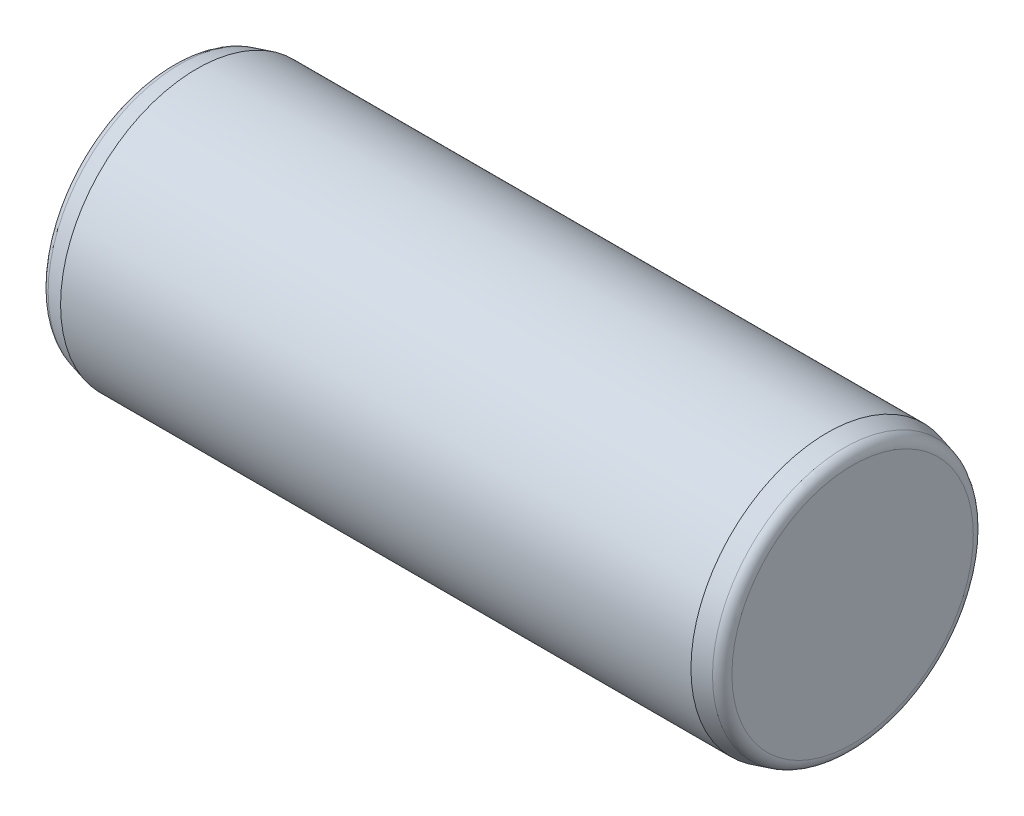
ISO-10303-21;
HEADER;
FILE_DESCRIPTION(('STEP AP214'),'2;1');
FILE_NAME('part.step','',(''),(''),'','','');
FILE_SCHEMA(('AUTOMOTIVE_DESIGN { 1 0 10303 214 1 1 1 1 }'));
ENDSEC;
DATA;
#1=APPLICATION_CONTEXT('core data for automotive mechanical design processes');
#2=APPLICATION_PROTOCOL_DEFINITION('international standard','automotive_design',2000,#1);
#3=PRODUCT_CONTEXT('',#1,'mechanical');
#4=PRODUCT('Part','Part','',(#3));
#5=PRODUCT_RELATED_PRODUCT_CATEGORY('part','',(#4));
#6=PRODUCT_DEFINITION_FORMATION('','',#4);
#7=PRODUCT_DEFINITION_CONTEXT('part definition',#1,'design');
#8=PRODUCT_DEFINITION('design','',#6,#7);
#9=PRODUCT_DEFINITION_SHAPE('','',#8);
#10=(LENGTH_UNIT() NAMED_UNIT(*) SI_UNIT(.MILLI.,.METRE.));
#11=(NAMED_UNIT(*) PLANE_ANGLE_UNIT() SI_UNIT($,.RADIAN.));
#12=(NAMED_UNIT(*) SI_UNIT($,.STERADIAN.) SOLID_ANGLE_UNIT());
#13=UNCERTAINTY_MEASURE_WITH_UNIT(LENGTH_MEASURE(1.E-05),#10,'distance_accuracy_value','');
#14=(GEOMETRIC_REPRESENTATION_CONTEXT(3) GLOBAL_UNCERTAINTY_ASSIGNED_CONTEXT((#13)) GLOBAL_UNIT_ASSIGNED_CONTEXT((#10,
#11,#12)) REPRESENTATION_CONTEXT('',''));
#15=CARTESIAN_POINT('',(0.,0.,0.));
#16=DIRECTION('',(0.,0.,1.));
#17=DIRECTION('',(1.,0.,0.));
#18=AXIS2_PLACEMENT_3D('',#15,#16,#17);
#19=CARTESIAN_POINT('',(0.,0.,0.));
#20=DIRECTION('',(1.,0.,0.));
#21=DIRECTION('',(0.,0.,-1.));
#22=AXIS2_PLACEMENT_3D('',#19,#20,#21);
#23=PLANE('',#22);
#24=CARTESIAN_POINT('',(0.,0.,0.));
#25=DIRECTION('',(1.,0.,0.));
#26=DIRECTION('',(0.,0.,-1.));
#27=AXIS2_PLACEMENT_3D('',#24,#25,#26);
#28=CIRCLE('',#27,5.31633650601052);
#29=CARTESIAN_POINT('',(0.,0.,-5.31633650601052));
#30=VERTEX_POINT('',#29);
#31=EDGE_CURVE('E56',#30,#30,#28,.F.);
#32=ORIENTED_EDGE('',*,*,#31,.T.);
#33=EDGE_LOOP('',(#32));
#34=FACE_BOUND('',#33,.T.);
#35=ADVANCED_FACE('F41',(#34),#23,.F.);
#36=CARTESIAN_POINT('',(1.11961524227056,0.,0.));
#37=DIRECTION('',(1.,0.,0.));
#38=DIRECTION('',(0.,0.,-1.));
#39=AXIS2_PLACEMENT_3D('',#36,#37,#38);
#40=CONICAL_SURFACE('',#39,6.,0.26179938779915);
#41=CARTESIAN_POINT('',(0.370590477448696,0.,0.));
#42=DIRECTION('',(-1.,0.,0.));
#43=DIRECTION('',(0.,0.,1.));
#44=AXIS2_PLACEMENT_3D('',#41,#42,#43);
#45=CIRCLE('',#44,5.79929941915506);
#46=CARTESIAN_POINT('',(0.370590477448696,0.,5.79929941915506));
#47=VERTEX_POINT('',#46);
#48=EDGE_CURVE('E52',#47,#47,#45,.F.);
#49=ORIENTED_EDGE('',*,*,#48,.T.);
#50=EDGE_LOOP('',(#49));
#51=FACE_BOUND('',#50,.T.);
#52=CARTESIAN_POINT('',(1.11961524227056,0.,0.));
#53=DIRECTION('',(-1.,0.,0.));
#54=DIRECTION('',(0.,0.,1.));
#55=AXIS2_PLACEMENT_3D('',#52,#53,#54);
#56=CIRCLE('',#55,6.);
#57=CARTESIAN_POINT('',(1.11961524227056,0.,6.));
#58=VERTEX_POINT('',#57);
#59=EDGE_CURVE('E61',#58,#58,#56,.T.);
#60=ORIENTED_EDGE('',*,*,#59,.T.);
#61=EDGE_LOOP('',(#60));
#62=FACE_BOUND('',#61,.T.);
#63=ADVANCED_FACE('F80',(#51,#62),#40,.T.);
#64=CARTESIAN_POINT('',(0.,0.,0.));
#65=DIRECTION('',(-1.,0.,0.));
#66=DIRECTION('',(0.,0.,1.));
#67=AXIS2_PLACEMENT_3D('',#64,#65,#66);
#68=CYLINDRICAL_SURFACE('',#67,6.);
#69=ORIENTED_EDGE('',*,*,#59,.F.);
#70=EDGE_LOOP('',(#69));
#71=FACE_BOUND('',#70,.T.);
#72=CARTESIAN_POINT('',(28.8803847577293,0.,0.));
#73=DIRECTION('',(-1.,0.,0.));
#74=DIRECTION('',(0.,0.,1.));
#75=AXIS2_PLACEMENT_3D('',#72,#73,#74);
#76=CIRCLE('',#75,6.);
#77=CARTESIAN_POINT('',(28.8803847577293,0.,6.));
#78=VERTEX_POINT('',#77);
#79=EDGE_CURVE('E64',#78,#78,#76,.T.);
#80=ORIENTED_EDGE('',*,*,#79,.T.);
#81=EDGE_LOOP('',(#80));
#82=FACE_BOUND('',#81,.T.);
#83=ADVANCED_FACE('F68',(#71,#82),#68,.T.);
#84=CARTESIAN_POINT('',(29.9999999999998,0.,0.));
#85=DIRECTION('',(-1.,0.,0.));
#86=DIRECTION('',(0.,0.,1.));
#87=AXIS2_PLACEMENT_3D('',#84,#85,#86);
#88=CONICAL_SURFACE('',#87,5.7,0.261799387799151);
#89=CARTESIAN_POINT('',(29.6294095225514,0.,0.));
#90=DIRECTION('',(1.,0.,0.));
#91=DIRECTION('',(0.,0.,-1.));
#92=AXIS2_PLACEMENT_3D('',#89,#90,#91);
#93=CIRCLE('',#92,5.79929941915505);
#94=CARTESIAN_POINT('',(29.6294095225514,0.,-5.79929941915506));
#95=VERTEX_POINT('',#94);
#96=EDGE_CURVE('E48',#95,#95,#93,.F.);
#97=ORIENTED_EDGE('',*,*,#96,.T.);
#98=EDGE_LOOP('',(#97));
#99=FACE_BOUND('',#98,.T.);
#100=ORIENTED_EDGE('',*,*,#79,.F.);
#101=EDGE_LOOP('',(#100));
#102=FACE_BOUND('',#101,.T.);
#103=ADVANCED_FACE('F70',(#99,#102),#88,.T.);
#104=CARTESIAN_POINT('',(29.9999999999998,5.69999999999993,0.));
#105=DIRECTION('',(-1.,0.,0.));
#106=DIRECTION('',(0.,0.,1.));
#107=AXIS2_PLACEMENT_3D('',#104,#105,#106);
#108=PLANE('',#107);
#109=CARTESIAN_POINT('',(29.9999999999998,0.,0.));
#110=DIRECTION('',(-1.,0.,0.));
#111=DIRECTION('',(0.,0.,1.));
#112=AXIS2_PLACEMENT_3D('',#109,#110,#111);
#113=CIRCLE('',#112,5.31633650601052);
#114=CARTESIAN_POINT('',(29.9999999999998,0.,5.31633650601052));
#115=VERTEX_POINT('',#114);
#116=EDGE_CURVE('E10',#115,#115,#113,.F.);
#117=ORIENTED_EDGE('',*,*,#116,.T.);
#118=EDGE_LOOP('',(#117));
#119=FACE_BOUND('',#118,.T.);
#120=ADVANCED_FACE('F72',(#119),#108,.F.);
#121=CARTESIAN_POINT('',(0.499999999999945,0.,0.));
#122=DIRECTION('',(1.,0.,0.));
#123=DIRECTION('',(0.,0.,-1.));
#124=AXIS2_PLACEMENT_3D('',#121,#122,#123);
#125=TOROIDAL_SURFACE('',#124,5.31633650601052,0.5);
#126=ORIENTED_EDGE('',*,*,#48,.F.);
#127=EDGE_LOOP('',(#126));
#128=FACE_BOUND('',#127,.T.);
#129=ORIENTED_EDGE('',*,*,#31,.F.);
#130=EDGE_LOOP('',(#129));
#131=FACE_BOUND('',#130,.T.);
#132=ADVANCED_FACE('F78',(#128,#131),#125,.T.);
#133=CARTESIAN_POINT('',(29.5000000000001,0.,0.));
#134=DIRECTION('',(-1.,0.,0.));
#135=DIRECTION('',(0.,0.,1.));
#136=AXIS2_PLACEMENT_3D('',#133,#134,#135);
#137=TOROIDAL_SURFACE('',#136,5.31633650601052,0.5);
#138=ORIENTED_EDGE('',*,*,#116,.F.);
#139=EDGE_LOOP('',(#138));
#140=FACE_BOUND('',#139,.T.);
#141=ORIENTED_EDGE('',*,*,#96,.F.);
#142=EDGE_LOOP('',(#141));
#143=FACE_BOUND('',#142,.T.);
#144=ADVANCED_FACE('F43',(#140,#143),#137,.T.);
#145=CLOSED_SHELL('',(#35,#63,#83,#103,#120,#132,#144));
#146=MANIFOLD_SOLID_BREP('B2',#145);
#147=ADVANCED_BREP_SHAPE_REPRESENTATION('',(#18,#146),#14);
#148=SHAPE_DEFINITION_REPRESENTATION(#9,#147);
ENDSEC;
END-ISO-10303-21;
